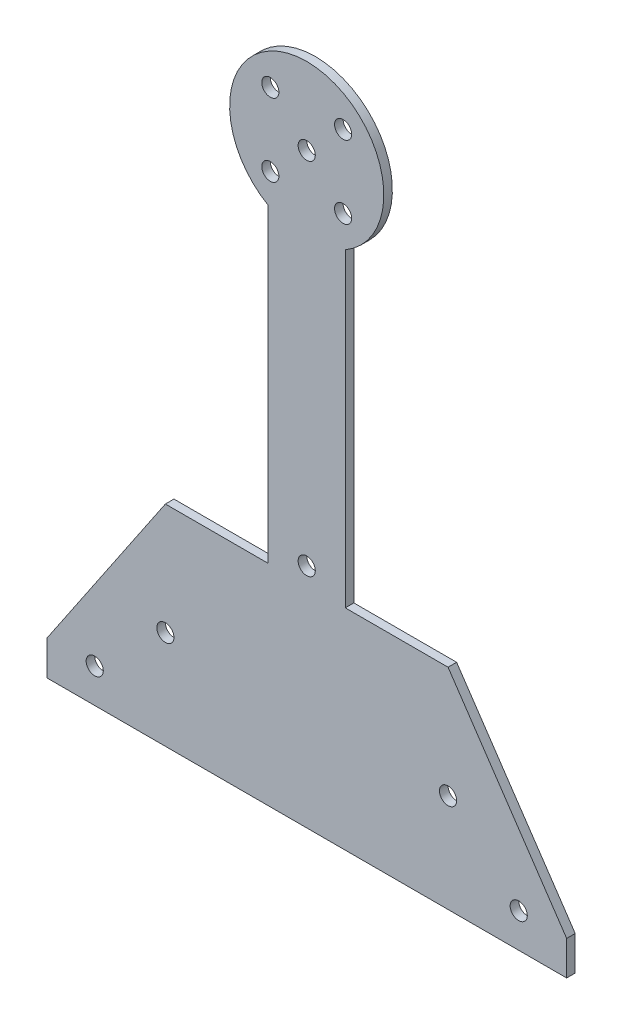
ISO-10303-21;
HEADER;
FILE_DESCRIPTION(('STEP AP214'),'2;1');
FILE_NAME('part.step','',(''),(''),'','','');
FILE_SCHEMA(('AUTOMOTIVE_DESIGN { 1 0 10303 214 1 1 1 1 }'));
ENDSEC;
DATA;
#1=APPLICATION_CONTEXT('core data for automotive mechanical design processes');
#2=APPLICATION_PROTOCOL_DEFINITION('international standard','automotive_design',2000,#1);
#3=PRODUCT_CONTEXT('',#1,'mechanical');
#4=PRODUCT('Part','Part','',(#3));
#5=PRODUCT_RELATED_PRODUCT_CATEGORY('part','',(#4));
#6=PRODUCT_DEFINITION_FORMATION('','',#4);
#7=PRODUCT_DEFINITION_CONTEXT('part definition',#1,'design');
#8=PRODUCT_DEFINITION('design','',#6,#7);
#9=PRODUCT_DEFINITION_SHAPE('','',#8);
#10=(LENGTH_UNIT() NAMED_UNIT(*) SI_UNIT(.MILLI.,.METRE.));
#11=(NAMED_UNIT(*) PLANE_ANGLE_UNIT() SI_UNIT($,.RADIAN.));
#12=(NAMED_UNIT(*) SI_UNIT($,.STERADIAN.) SOLID_ANGLE_UNIT());
#13=UNCERTAINTY_MEASURE_WITH_UNIT(LENGTH_MEASURE(1.E-05),#10,'distance_accuracy_value','');
#14=(GEOMETRIC_REPRESENTATION_CONTEXT(3) GLOBAL_UNCERTAINTY_ASSIGNED_CONTEXT((#13)) GLOBAL_UNIT_ASSIGNED_CONTEXT((#10,
#11,#12)) REPRESENTATION_CONTEXT('',''));
#15=CARTESIAN_POINT('',(0.,0.,0.));
#16=DIRECTION('',(0.,0.,1.));
#17=DIRECTION('',(1.,0.,0.));
#18=AXIS2_PLACEMENT_3D('',#15,#16,#17);
#19=CARTESIAN_POINT('',(-0.291428571428588,121.645714285714,2.));
#20=DIRECTION('',(0.,0.,-1.));
#21=DIRECTION('',(-1.,0.,0.));
#22=AXIS2_PLACEMENT_3D('',#19,#20,#21);
#23=CYLINDRICAL_SURFACE('',#22,18.);
#24=CARTESIAN_POINT('',(-0.291428571428588,121.645714285714,0.));
#25=DIRECTION('',(0.,0.,1.));
#26=DIRECTION('',(1.,0.,0.));
#27=AXIS2_PLACEMENT_3D('',#24,#25,#26);
#28=CIRCLE('',#27,18.);
#29=CARTESIAN_POINT('',(-9.29142857142858,106.057257017594,0.));
#30=VERTEX_POINT('',#29);
#31=CARTESIAN_POINT('',(8.7085714285714,106.057257017594,0.));
#32=VERTEX_POINT('',#31);
#33=EDGE_CURVE('E171',#30,#32,#28,.F.);
#34=ORIENTED_EDGE('',*,*,#33,.F.);
#35=DIRECTION('',(0.,0.,-1.));
#36=VECTOR('',#35,1.);
#37=CARTESIAN_POINT('',(-9.29142857142858,106.057257017594,2.));
#38=LINE('',#37,#36);
#39=CARTESIAN_POINT('',(-9.29142857142858,106.057257017594,2.));
#40=VERTEX_POINT('',#39);
#41=EDGE_CURVE('E11',#40,#30,#38,.T.);
#42=ORIENTED_EDGE('',*,*,#41,.F.);
#43=CARTESIAN_POINT('',(-0.291428571428588,121.645714285714,2.));
#44=DIRECTION('',(0.,0.,1.));
#45=DIRECTION('',(1.,0.,0.));
#46=AXIS2_PLACEMENT_3D('',#43,#44,#45);
#47=CIRCLE('',#46,18.);
#48=CARTESIAN_POINT('',(8.7085714285714,106.057257017594,2.));
#49=VERTEX_POINT('',#48);
#50=EDGE_CURVE('E255',#40,#49,#47,.F.);
#51=ORIENTED_EDGE('',*,*,#50,.T.);
#52=DIRECTION('',(0.,0.,-1.));
#53=VECTOR('',#52,1.);
#54=CARTESIAN_POINT('',(8.7085714285714,106.057257017594,2.));
#55=LINE('',#54,#53);
#56=EDGE_CURVE('E92',#49,#32,#55,.T.);
#57=ORIENTED_EDGE('',*,*,#56,.T.);
#58=EDGE_LOOP('',(#34,#42,#51,#57));
#59=FACE_BOUND('',#58,.T.);
#60=ADVANCED_FACE('F35',(#59),#23,.T.);
#61=CARTESIAN_POINT('',(-9.29142857142858,0.,2.));
#62=DIRECTION('',(-1.,0.,0.));
#63=DIRECTION('',(0.,0.,1.));
#64=AXIS2_PLACEMENT_3D('',#61,#62,#63);
#65=PLANE('',#64);
#66=DIRECTION('',(0.,1.,0.));
#67=VECTOR('',#66,1.);
#68=CARTESIAN_POINT('',(-9.29142857142858,0.,0.));
#69=LINE('',#68,#67);
#70=CARTESIAN_POINT('',(-9.29142857142858,33.6457142857143,0.));
#71=VERTEX_POINT('',#70);
#72=EDGE_CURVE('E174',#71,#30,#69,.T.);
#73=ORIENTED_EDGE('',*,*,#72,.F.);
#74=DIRECTION('',(0.,0.,-1.));
#75=VECTOR('',#74,1.);
#76=CARTESIAN_POINT('',(-9.29142857142858,33.6457142857143,2.));
#77=LINE('',#76,#75);
#78=CARTESIAN_POINT('',(-9.29142857142858,33.6457142857143,2.));
#79=VERTEX_POINT('',#78);
#80=EDGE_CURVE('E44',#79,#71,#77,.T.);
#81=ORIENTED_EDGE('',*,*,#80,.F.);
#82=DIRECTION('',(0.,1.,0.));
#83=VECTOR('',#82,1.);
#84=CARTESIAN_POINT('',(-9.29142857142858,0.,2.));
#85=LINE('',#84,#83);
#86=EDGE_CURVE('E253',#79,#40,#85,.T.);
#87=ORIENTED_EDGE('',*,*,#86,.T.);
#88=ORIENTED_EDGE('',*,*,#41,.T.);
#89=EDGE_LOOP('',(#73,#81,#87,#88));
#90=FACE_BOUND('',#89,.T.);
#91=ADVANCED_FACE('F252',(#90),#65,.T.);
#92=CARTESIAN_POINT('',(0.,33.6457142857143,2.));
#93=DIRECTION('',(0.,-1.,0.));
#94=DIRECTION('',(0.,0.,-1.));
#95=AXIS2_PLACEMENT_3D('',#92,#93,#94);
#96=PLANE('',#95);
#97=DIRECTION('',(-1.,0.,0.));
#98=VECTOR('',#97,1.);
#99=CARTESIAN_POINT('',(0.,33.6457142857143,0.));
#100=LINE('',#99,#98);
#101=CARTESIAN_POINT('',(-33.2914285714285,33.6457142857143,0.));
#102=VERTEX_POINT('',#101);
#103=EDGE_CURVE('E177',#71,#102,#100,.T.);
#104=ORIENTED_EDGE('',*,*,#103,.T.);
#105=DIRECTION('',(0.,0.,-1.));
#106=VECTOR('',#105,1.);
#107=CARTESIAN_POINT('',(-33.2914285714285,33.6457142857143,2.));
#108=LINE('',#107,#106);
#109=CARTESIAN_POINT('',(-33.2914285714285,33.6457142857143,2.));
#110=VERTEX_POINT('',#109);
#111=EDGE_CURVE('E236',#110,#102,#108,.T.);
#112=ORIENTED_EDGE('',*,*,#111,.F.);
#113=DIRECTION('',(-1.,0.,0.));
#114=VECTOR('',#113,1.);
#115=CARTESIAN_POINT('',(0.,33.6457142857143,2.));
#116=LINE('',#115,#114);
#117=EDGE_CURVE('E244',#79,#110,#116,.T.);
#118=ORIENTED_EDGE('',*,*,#117,.F.);
#119=ORIENTED_EDGE('',*,*,#80,.T.);
#120=EDGE_LOOP('',(#104,#112,#118,#119));
#121=FACE_BOUND('',#120,.T.);
#122=ADVANCED_FACE('F241',(#121),#96,.F.);
#123=CARTESIAN_POINT('',(-38.466867215642,25.9839493997509,2.));
#124=DIRECTION('',(0.828660684377225,-0.559751257405884,0.));
#125=DIRECTION('',(0.559751257405884,0.828660684377225,0.));
#126=AXIS2_PLACEMENT_3D('',#123,#124,#125);
#127=PLANE('',#126);
#128=DIRECTION('',(-0.559751257405884,-0.828660684377225,0.));
#129=VECTOR('',#128,1.);
#130=CARTESIAN_POINT('',(-38.466867215642,25.9839493997509,0.));
#131=LINE('',#130,#129);
#132=CARTESIAN_POINT('',(-60.9864815482557,-7.35428571428547,0.));
#133=VERTEX_POINT('',#132);
#134=EDGE_CURVE('E180',#102,#133,#131,.T.);
#135=ORIENTED_EDGE('',*,*,#134,.T.);
#136=DIRECTION('',(0.,0.,-1.));
#137=VECTOR('',#136,1.);
#138=CARTESIAN_POINT('',(-60.9864815482557,-7.35428571428547,2.));
#139=LINE('',#138,#137);
#140=CARTESIAN_POINT('',(-60.9864815482557,-7.35428571428547,2.));
#141=VERTEX_POINT('',#140);
#142=EDGE_CURVE('E233',#141,#133,#139,.T.);
#143=ORIENTED_EDGE('',*,*,#142,.F.);
#144=DIRECTION('',(-0.559751257405884,-0.828660684377225,0.));
#145=VECTOR('',#144,1.);
#146=CARTESIAN_POINT('',(-38.466867215642,25.9839493997509,2.));
#147=LINE('',#146,#145);
#148=EDGE_CURVE('E262',#110,#141,#147,.T.);
#149=ORIENTED_EDGE('',*,*,#148,.F.);
#150=ORIENTED_EDGE('',*,*,#111,.T.);
#151=EDGE_LOOP('',(#135,#143,#149,#150));
#152=FACE_BOUND('',#151,.T.);
#153=ADVANCED_FACE('F280',(#152),#127,.F.);
#154=CARTESIAN_POINT('',(-60.9864815482558,0.,2.));
#155=DIRECTION('',(1.,0.,0.));
#156=DIRECTION('',(0.,0.,-1.));
#157=AXIS2_PLACEMENT_3D('',#154,#155,#156);
#158=PLANE('',#157);
#159=DIRECTION('',(0.,-1.,0.));
#160=VECTOR('',#159,1.);
#161=CARTESIAN_POINT('',(-60.9864815482558,0.,0.));
#162=LINE('',#161,#160);
#163=CARTESIAN_POINT('',(-60.9864815482558,-15.3542857142855,0.));
#164=VERTEX_POINT('',#163);
#165=EDGE_CURVE('E183',#133,#164,#162,.T.);
#166=ORIENTED_EDGE('',*,*,#165,.T.);
#167=DIRECTION('',(0.,0.,-1.));
#168=VECTOR('',#167,1.);
#169=CARTESIAN_POINT('',(-60.9864815482558,-15.3542857142855,2.));
#170=LINE('',#169,#168);
#171=CARTESIAN_POINT('',(-60.9864815482558,-15.3542857142855,2.));
#172=VERTEX_POINT('',#171);
#173=EDGE_CURVE('E230',#172,#164,#170,.T.);
#174=ORIENTED_EDGE('',*,*,#173,.F.);
#175=DIRECTION('',(0.,-1.,0.));
#176=VECTOR('',#175,1.);
#177=CARTESIAN_POINT('',(-60.9864815482558,0.,2.));
#178=LINE('',#177,#176);
#179=EDGE_CURVE('E265',#141,#172,#178,.T.);
#180=ORIENTED_EDGE('',*,*,#179,.F.);
#181=ORIENTED_EDGE('',*,*,#142,.T.);
#182=EDGE_LOOP('',(#166,#174,#180,#181));
#183=FACE_BOUND('',#182,.T.);
#184=ADVANCED_FACE('F277',(#183),#158,.F.);
#185=CARTESIAN_POINT('',(0.,-15.3542857142855,2.));
#186=DIRECTION('',(0.,1.,0.));
#187=DIRECTION('',(0.,0.,1.));
#188=AXIS2_PLACEMENT_3D('',#185,#186,#187);
#189=PLANE('',#188);
#190=DIRECTION('',(1.,0.,0.));
#191=VECTOR('',#190,1.);
#192=CARTESIAN_POINT('',(0.,-15.3542857142855,0.));
#193=LINE('',#192,#191);
#194=CARTESIAN_POINT('',(60.4036244053986,-15.3542857142855,0.));
#195=VERTEX_POINT('',#194);
#196=EDGE_CURVE('E186',#164,#195,#193,.T.);
#197=ORIENTED_EDGE('',*,*,#196,.T.);
#198=DIRECTION('',(0.,0.,-1.));
#199=VECTOR('',#198,1.);
#200=CARTESIAN_POINT('',(60.4036244053986,-15.3542857142855,2.));
#201=LINE('',#200,#199);
#202=CARTESIAN_POINT('',(60.4036244053986,-15.3542857142855,2.));
#203=VERTEX_POINT('',#202);
#204=EDGE_CURVE('E228',#203,#195,#201,.T.);
#205=ORIENTED_EDGE('',*,*,#204,.F.);
#206=DIRECTION('',(1.,0.,0.));
#207=VECTOR('',#206,1.);
#208=CARTESIAN_POINT('',(0.,-15.3542857142855,2.));
#209=LINE('',#208,#207);
#210=EDGE_CURVE('E268',#172,#203,#209,.T.);
#211=ORIENTED_EDGE('',*,*,#210,.F.);
#212=ORIENTED_EDGE('',*,*,#173,.T.);
#213=EDGE_LOOP('',(#197,#205,#211,#212));
#214=FACE_BOUND('',#213,.T.);
#215=ADVANCED_FACE('F275',(#214),#189,.F.);
#216=CARTESIAN_POINT('',(60.4036244053986,0.,2.));
#217=DIRECTION('',(1.,0.,0.));
#218=DIRECTION('',(0.,0.,-1.));
#219=AXIS2_PLACEMENT_3D('',#216,#217,#218);
#220=PLANE('',#219);
#221=DIRECTION('',(0.,-1.,0.));
#222=VECTOR('',#221,1.);
#223=CARTESIAN_POINT('',(60.4036244053986,0.,0.));
#224=LINE('',#223,#222);
#225=CARTESIAN_POINT('',(60.4036244053986,-7.35428571428548,0.));
#226=VERTEX_POINT('',#225);
#227=EDGE_CURVE('E189',#226,#195,#224,.T.);
#228=ORIENTED_EDGE('',*,*,#227,.F.);
#229=DIRECTION('',(0.,0.,-1.));
#230=VECTOR('',#229,1.);
#231=CARTESIAN_POINT('',(60.4036244053986,-7.35428571428548,2.));
#232=LINE('',#231,#230);
#233=CARTESIAN_POINT('',(60.4036244053986,-7.35428571428548,2.));
#234=VERTEX_POINT('',#233);
#235=EDGE_CURVE('E127',#234,#226,#232,.T.);
#236=ORIENTED_EDGE('',*,*,#235,.F.);
#237=DIRECTION('',(0.,-1.,0.));
#238=VECTOR('',#237,1.);
#239=CARTESIAN_POINT('',(60.4036244053986,0.,2.));
#240=LINE('',#239,#238);
#241=EDGE_CURVE('E134',#234,#203,#240,.T.);
#242=ORIENTED_EDGE('',*,*,#241,.T.);
#243=ORIENTED_EDGE('',*,*,#204,.T.);
#244=EDGE_LOOP('',(#228,#236,#242,#243));
#245=FACE_BOUND('',#244,.T.);
#246=ADVANCED_FACE('F271',(#245),#220,.T.);
#247=CARTESIAN_POINT('',(38.0666317296824,25.7135946927544,2.));
#248=DIRECTION('',(0.828660684377225,0.559751257405884,0.));
#249=DIRECTION('',(-0.559751257405884,0.828660684377225,0.));
#250=AXIS2_PLACEMENT_3D('',#247,#248,#249);
#251=PLANE('',#250);
#252=DIRECTION('',(0.559751257405884,-0.828660684377225,0.));
#253=VECTOR('',#252,1.);
#254=CARTESIAN_POINT('',(38.0666317296824,25.7135946927544,0.));
#255=LINE('',#254,#253);
#256=CARTESIAN_POINT('',(32.7085714285713,33.6457142857143,0.));
#257=VERTEX_POINT('',#256);
#258=EDGE_CURVE('E122',#257,#226,#255,.T.);
#259=ORIENTED_EDGE('',*,*,#258,.F.);
#260=DIRECTION('',(0.,0.,-1.));
#261=VECTOR('',#260,1.);
#262=CARTESIAN_POINT('',(32.7085714285713,33.6457142857143,2.));
#263=LINE('',#262,#261);
#264=CARTESIAN_POINT('',(32.7085714285713,33.6457142857143,2.));
#265=VERTEX_POINT('',#264);
#266=EDGE_CURVE('E117',#265,#257,#263,.T.);
#267=ORIENTED_EDGE('',*,*,#266,.F.);
#268=DIRECTION('',(0.559751257405884,-0.828660684377225,0.));
#269=VECTOR('',#268,1.);
#270=CARTESIAN_POINT('',(38.0666317296824,25.7135946927544,2.));
#271=LINE('',#270,#269);
#272=EDGE_CURVE('E120',#265,#234,#271,.T.);
#273=ORIENTED_EDGE('',*,*,#272,.T.);
#274=ORIENTED_EDGE('',*,*,#235,.T.);
#275=EDGE_LOOP('',(#259,#267,#273,#274));
#276=FACE_BOUND('',#275,.T.);
#277=ADVANCED_FACE('F119',(#276),#251,.T.);
#278=CARTESIAN_POINT('',(0.,33.6457142857143,2.));
#279=DIRECTION('',(0.,1.,0.));
#280=DIRECTION('',(0.,0.,1.));
#281=AXIS2_PLACEMENT_3D('',#278,#279,#280);
#282=PLANE('',#281);
#283=DIRECTION('',(1.,0.,0.));
#284=VECTOR('',#283,1.);
#285=CARTESIAN_POINT('',(0.,33.6457142857143,0.));
#286=LINE('',#285,#284);
#287=CARTESIAN_POINT('',(8.7085714285714,33.6457142857143,0.));
#288=VERTEX_POINT('',#287);
#289=EDGE_CURVE('E193',#288,#257,#286,.T.);
#290=ORIENTED_EDGE('',*,*,#289,.F.);
#291=DIRECTION('',(0.,0.,-1.));
#292=VECTOR('',#291,1.);
#293=CARTESIAN_POINT('',(8.7085714285714,33.6457142857143,2.));
#294=LINE('',#293,#292);
#295=CARTESIAN_POINT('',(8.7085714285714,33.6457142857143,2.));
#296=VERTEX_POINT('',#295);
#297=EDGE_CURVE('E85',#296,#288,#294,.T.);
#298=ORIENTED_EDGE('',*,*,#297,.F.);
#299=DIRECTION('',(1.,0.,0.));
#300=VECTOR('',#299,1.);
#301=CARTESIAN_POINT('',(0.,33.6457142857143,2.));
#302=LINE('',#301,#300);
#303=EDGE_CURVE('E132',#296,#265,#302,.T.);
#304=ORIENTED_EDGE('',*,*,#303,.T.);
#305=ORIENTED_EDGE('',*,*,#266,.T.);
#306=EDGE_LOOP('',(#290,#298,#304,#305));
#307=FACE_BOUND('',#306,.T.);
#308=ADVANCED_FACE('F136',(#307),#282,.T.);
#309=CARTESIAN_POINT('',(-33.2914285714285,7.64571428571553,2.));
#310=DIRECTION('',(0.,0.,-1.));
#311=DIRECTION('',(-1.,0.,0.));
#312=AXIS2_PLACEMENT_3D('',#309,#310,#311);
#313=CYLINDRICAL_SURFACE('',#312,2.);
#314=CARTESIAN_POINT('',(-33.2914285714285,7.64571428571553,2.));
#315=DIRECTION('',(0.,0.,1.));
#316=DIRECTION('',(1.,0.,0.));
#317=AXIS2_PLACEMENT_3D('',#314,#315,#316);
#318=CIRCLE('',#317,2.);
#319=CARTESIAN_POINT('',(-31.2914285714285,7.64571428571553,2.));
#320=VERTEX_POINT('',#319);
#321=EDGE_CURVE('E162',#320,#320,#318,.T.);
#322=ORIENTED_EDGE('',*,*,#321,.T.);
#323=EDGE_LOOP('',(#322));
#324=FACE_BOUND('',#323,.T.);
#325=CARTESIAN_POINT('',(-33.2914285714285,7.64571428571553,0.));
#326=DIRECTION('',(0.,0.,1.));
#327=DIRECTION('',(1.,0.,0.));
#328=AXIS2_PLACEMENT_3D('',#325,#326,#327);
#329=CIRCLE('',#328,2.);
#330=CARTESIAN_POINT('',(-31.2914285714285,7.64571428571553,0.));
#331=VERTEX_POINT('',#330);
#332=EDGE_CURVE('E218',#331,#331,#329,.T.);
#333=ORIENTED_EDGE('',*,*,#332,.F.);
#334=EDGE_LOOP('',(#333));
#335=FACE_BOUND('',#334,.T.);
#336=ADVANCED_FACE('F344',(#324,#335),#313,.F.);
#337=CARTESIAN_POINT('',(49.2085714285714,-7.3542857142857,2.));
#338=DIRECTION('',(0.,0.,-1.));
#339=DIRECTION('',(-1.,0.,0.));
#340=AXIS2_PLACEMENT_3D('',#337,#338,#339);
#341=CYLINDRICAL_SURFACE('',#340,2.);
#342=CARTESIAN_POINT('',(49.2085714285714,-7.3542857142857,2.));
#343=DIRECTION('',(0.,0.,1.));
#344=DIRECTION('',(1.,0.,0.));
#345=AXIS2_PLACEMENT_3D('',#342,#343,#344);
#346=CIRCLE('',#345,2.);
#347=CARTESIAN_POINT('',(51.2085714285714,-7.3542857142857,2.));
#348=VERTEX_POINT('',#347);
#349=EDGE_CURVE('E159',#348,#348,#346,.T.);
#350=ORIENTED_EDGE('',*,*,#349,.T.);
#351=EDGE_LOOP('',(#350));
#352=FACE_BOUND('',#351,.T.);
#353=CARTESIAN_POINT('',(49.2085714285714,-7.3542857142857,0.));
#354=DIRECTION('',(0.,0.,1.));
#355=DIRECTION('',(1.,0.,0.));
#356=AXIS2_PLACEMENT_3D('',#353,#354,#355);
#357=CIRCLE('',#356,2.);
#358=CARTESIAN_POINT('',(51.2085714285714,-7.3542857142857,0.));
#359=VERTEX_POINT('',#358);
#360=EDGE_CURVE('E215',#359,#359,#357,.T.);
#361=ORIENTED_EDGE('',*,*,#360,.F.);
#362=EDGE_LOOP('',(#361));
#363=FACE_BOUND('',#362,.T.);
#364=ADVANCED_FACE('F353',(#352,#363),#341,.F.);
#365=CARTESIAN_POINT('',(-49.7914285714285,-7.35428571428548,2.));
#366=DIRECTION('',(0.,0.,-1.));
#367=DIRECTION('',(-1.,0.,0.));
#368=AXIS2_PLACEMENT_3D('',#365,#366,#367);
#369=CYLINDRICAL_SURFACE('',#368,2.);
#370=CARTESIAN_POINT('',(-49.7914285714285,-7.35428571428548,2.));
#371=DIRECTION('',(0.,0.,1.));
#372=DIRECTION('',(1.,0.,0.));
#373=AXIS2_PLACEMENT_3D('',#370,#371,#372);
#374=CIRCLE('',#373,2.);
#375=CARTESIAN_POINT('',(-47.7914285714285,-7.35428571428548,2.));
#376=VERTEX_POINT('',#375);
#377=EDGE_CURVE('E156',#376,#376,#374,.F.);
#378=ORIENTED_EDGE('',*,*,#377,.F.);
#379=EDGE_LOOP('',(#378));
#380=FACE_BOUND('',#379,.T.);
#381=CARTESIAN_POINT('',(-49.7914285714285,-7.35428571428548,0.));
#382=DIRECTION('',(0.,0.,1.));
#383=DIRECTION('',(1.,0.,0.));
#384=AXIS2_PLACEMENT_3D('',#381,#382,#383);
#385=CIRCLE('',#384,2.);
#386=CARTESIAN_POINT('',(-47.7914285714285,-7.35428571428548,0.));
#387=VERTEX_POINT('',#386);
#388=EDGE_CURVE('E212',#387,#387,#385,.F.);
#389=ORIENTED_EDGE('',*,*,#388,.T.);
#390=EDGE_LOOP('',(#389));
#391=FACE_BOUND('',#390,.T.);
#392=ADVANCED_FACE('F363',(#380,#391),#369,.F.);
#393=CARTESIAN_POINT('',(8.20857142857141,130.145714285714,2.));
#394=DIRECTION('',(0.,0.,-1.));
#395=DIRECTION('',(-1.,0.,0.));
#396=AXIS2_PLACEMENT_3D('',#393,#394,#395);
#397=CYLINDRICAL_SURFACE('',#396,2.);
#398=CARTESIAN_POINT('',(8.20857142857141,130.145714285714,2.));
#399=DIRECTION('',(0.,0.,1.));
#400=DIRECTION('',(1.,0.,0.));
#401=AXIS2_PLACEMENT_3D('',#398,#399,#400);
#402=CIRCLE('',#401,2.);
#403=CARTESIAN_POINT('',(10.2085714285714,130.145714285714,2.));
#404=VERTEX_POINT('',#403);
#405=EDGE_CURVE('E153',#404,#404,#402,.T.);
#406=ORIENTED_EDGE('',*,*,#405,.T.);
#407=EDGE_LOOP('',(#406));
#408=FACE_BOUND('',#407,.T.);
#409=CARTESIAN_POINT('',(8.20857142857141,130.145714285714,0.));
#410=DIRECTION('',(0.,0.,1.));
#411=DIRECTION('',(1.,0.,0.));
#412=AXIS2_PLACEMENT_3D('',#409,#410,#411);
#413=CIRCLE('',#412,2.);
#414=CARTESIAN_POINT('',(10.2085714285714,130.145714285714,0.));
#415=VERTEX_POINT('',#414);
#416=EDGE_CURVE('E209',#415,#415,#413,.T.);
#417=ORIENTED_EDGE('',*,*,#416,.F.);
#418=EDGE_LOOP('',(#417));
#419=FACE_BOUND('',#418,.T.);
#420=ADVANCED_FACE('F373',(#408,#419),#397,.F.);
#421=CARTESIAN_POINT('',(-0.291428571428588,37.6457142857143,2.));
#422=DIRECTION('',(0.,0.,-1.));
#423=DIRECTION('',(-1.,0.,0.));
#424=AXIS2_PLACEMENT_3D('',#421,#422,#423);
#425=CYLINDRICAL_SURFACE('',#424,2.);
#426=CARTESIAN_POINT('',(-0.291428571428588,37.6457142857143,2.));
#427=DIRECTION('',(0.,0.,1.));
#428=DIRECTION('',(1.,0.,0.));
#429=AXIS2_PLACEMENT_3D('',#426,#427,#428);
#430=CIRCLE('',#429,2.);
#431=CARTESIAN_POINT('',(1.70857142857141,37.6457142857143,2.));
#432=VERTEX_POINT('',#431);
#433=EDGE_CURVE('E150',#432,#432,#430,.T.);
#434=ORIENTED_EDGE('',*,*,#433,.T.);
#435=EDGE_LOOP('',(#434));
#436=FACE_BOUND('',#435,.T.);
#437=CARTESIAN_POINT('',(-0.291428571428588,37.6457142857143,0.));
#438=DIRECTION('',(0.,0.,1.));
#439=DIRECTION('',(1.,0.,0.));
#440=AXIS2_PLACEMENT_3D('',#437,#438,#439);
#441=CIRCLE('',#440,2.);
#442=CARTESIAN_POINT('',(1.70857142857141,37.6457142857143,0.));
#443=VERTEX_POINT('',#442);
#444=EDGE_CURVE('E206',#443,#443,#441,.T.);
#445=ORIENTED_EDGE('',*,*,#444,.F.);
#446=EDGE_LOOP('',(#445));
#447=FACE_BOUND('',#446,.T.);
#448=ADVANCED_FACE('F383',(#436,#447),#425,.F.);
#449=CARTESIAN_POINT('',(8.20857142857163,113.145714285714,2.));
#450=DIRECTION('',(0.,0.,-1.));
#451=DIRECTION('',(-1.,0.,0.));
#452=AXIS2_PLACEMENT_3D('',#449,#450,#451);
#453=CYLINDRICAL_SURFACE('',#452,2.);
#454=CARTESIAN_POINT('',(8.20857142857163,113.145714285714,2.));
#455=DIRECTION('',(0.,0.,1.));
#456=DIRECTION('',(1.,0.,0.));
#457=AXIS2_PLACEMENT_3D('',#454,#455,#456);
#458=CIRCLE('',#457,2.);
#459=CARTESIAN_POINT('',(10.2085714285716,113.145714285714,2.));
#460=VERTEX_POINT('',#459);
#461=EDGE_CURVE('E147',#460,#460,#458,.T.);
#462=ORIENTED_EDGE('',*,*,#461,.T.);
#463=EDGE_LOOP('',(#462));
#464=FACE_BOUND('',#463,.T.);
#465=CARTESIAN_POINT('',(8.20857142857163,113.145714285714,0.));
#466=DIRECTION('',(0.,0.,1.));
#467=DIRECTION('',(1.,0.,0.));
#468=AXIS2_PLACEMENT_3D('',#465,#466,#467);
#469=CIRCLE('',#468,2.);
#470=CARTESIAN_POINT('',(10.2085714285716,113.145714285714,0.));
#471=VERTEX_POINT('',#470);
#472=EDGE_CURVE('E203',#471,#471,#469,.T.);
#473=ORIENTED_EDGE('',*,*,#472,.F.);
#474=EDGE_LOOP('',(#473));
#475=FACE_BOUND('',#474,.T.);
#476=ADVANCED_FACE('F393',(#464,#475),#453,.F.);
#477=CARTESIAN_POINT('',(-8.7914285714284,113.145714285714,2.));
#478=DIRECTION('',(0.,0.,-1.));
#479=DIRECTION('',(-1.,0.,0.));
#480=AXIS2_PLACEMENT_3D('',#477,#478,#479);
#481=CYLINDRICAL_SURFACE('',#480,2.);
#482=CARTESIAN_POINT('',(-8.7914285714284,113.145714285714,2.));
#483=DIRECTION('',(0.,0.,1.));
#484=DIRECTION('',(1.,0.,0.));
#485=AXIS2_PLACEMENT_3D('',#482,#483,#484);
#486=CIRCLE('',#485,2.);
#487=CARTESIAN_POINT('',(-6.79142857142841,113.145714285714,2.));
#488=VERTEX_POINT('',#487);
#489=EDGE_CURVE('E144',#488,#488,#486,.T.);
#490=ORIENTED_EDGE('',*,*,#489,.T.);
#491=EDGE_LOOP('',(#490));
#492=FACE_BOUND('',#491,.T.);
#493=CARTESIAN_POINT('',(-8.7914285714284,113.145714285714,0.));
#494=DIRECTION('',(0.,0.,1.));
#495=DIRECTION('',(1.,0.,0.));
#496=AXIS2_PLACEMENT_3D('',#493,#494,#495);
#497=CIRCLE('',#496,2.);
#498=CARTESIAN_POINT('',(-6.79142857142841,113.145714285714,0.));
#499=VERTEX_POINT('',#498);
#500=EDGE_CURVE('E200',#499,#499,#497,.T.);
#501=ORIENTED_EDGE('',*,*,#500,.F.);
#502=EDGE_LOOP('',(#501));
#503=FACE_BOUND('',#502,.T.);
#504=ADVANCED_FACE('F403',(#492,#503),#481,.F.);
#505=CARTESIAN_POINT('',(-8.79142857142853,130.145714285714,2.));
#506=DIRECTION('',(0.,0.,-1.));
#507=DIRECTION('',(-1.,0.,0.));
#508=AXIS2_PLACEMENT_3D('',#505,#506,#507);
#509=CYLINDRICAL_SURFACE('',#508,1.99999999999999);
#510=CARTESIAN_POINT('',(-8.79142857142853,130.145714285714,2.));
#511=DIRECTION('',(0.,0.,1.));
#512=DIRECTION('',(1.,0.,0.));
#513=AXIS2_PLACEMENT_3D('',#510,#511,#512);
#514=CIRCLE('',#513,1.99999999999999);
#515=CARTESIAN_POINT('',(-6.79142857142855,130.145714285714,2.));
#516=VERTEX_POINT('',#515);
#517=EDGE_CURVE('E138',#516,#516,#514,.T.);
#518=ORIENTED_EDGE('',*,*,#517,.T.);
#519=EDGE_LOOP('',(#518));
#520=FACE_BOUND('',#519,.T.);
#521=CARTESIAN_POINT('',(-8.79142857142853,130.145714285714,0.));
#522=DIRECTION('',(0.,0.,1.));
#523=DIRECTION('',(1.,0.,0.));
#524=AXIS2_PLACEMENT_3D('',#521,#522,#523);
#525=CIRCLE('',#524,1.99999999999999);
#526=CARTESIAN_POINT('',(-6.79142857142855,130.145714285714,0.));
#527=VERTEX_POINT('',#526);
#528=EDGE_CURVE('E197',#527,#527,#525,.T.);
#529=ORIENTED_EDGE('',*,*,#528,.F.);
#530=EDGE_LOOP('',(#529));
#531=FACE_BOUND('',#530,.T.);
#532=ADVANCED_FACE('F413',(#520,#531),#509,.F.);
#533=CARTESIAN_POINT('',(8.7085714285714,0.,2.));
#534=DIRECTION('',(-1.,0.,0.));
#535=DIRECTION('',(0.,0.,1.));
#536=AXIS2_PLACEMENT_3D('',#533,#534,#535);
#537=PLANE('',#536);
#538=DIRECTION('',(0.,1.,0.));
#539=VECTOR('',#538,1.);
#540=CARTESIAN_POINT('',(8.7085714285714,0.,0.));
#541=LINE('',#540,#539);
#542=EDGE_CURVE('E195',#288,#32,#541,.T.);
#543=ORIENTED_EDGE('',*,*,#542,.T.);
#544=ORIENTED_EDGE('',*,*,#56,.F.);
#545=DIRECTION('',(0.,1.,0.));
#546=VECTOR('',#545,1.);
#547=CARTESIAN_POINT('',(8.7085714285714,0.,2.));
#548=LINE('',#547,#546);
#549=EDGE_CURVE('E52',#296,#49,#548,.T.);
#550=ORIENTED_EDGE('',*,*,#549,.F.);
#551=ORIENTED_EDGE('',*,*,#297,.T.);
#552=EDGE_LOOP('',(#543,#544,#550,#551));
#553=FACE_BOUND('',#552,.T.);
#554=ADVANCED_FACE('F254',(#553),#537,.F.);
#555=CARTESIAN_POINT('',(-0.291428571428588,121.645714285714,2.));
#556=DIRECTION('',(0.,0.,-1.));
#557=DIRECTION('',(-1.,0.,0.));
#558=AXIS2_PLACEMENT_3D('',#555,#556,#557);
#559=CYLINDRICAL_SURFACE('',#558,2.);
#560=CARTESIAN_POINT('',(-0.291428571428588,121.645714285714,2.));
#561=DIRECTION('',(0.,0.,1.));
#562=DIRECTION('',(1.,0.,0.));
#563=AXIS2_PLACEMENT_3D('',#560,#561,#562);
#564=CIRCLE('',#563,2.);
#565=CARTESIAN_POINT('',(1.70857142857141,121.645714285714,2.));
#566=VERTEX_POINT('',#565);
#567=EDGE_CURVE('E224',#566,#566,#564,.T.);
#568=ORIENTED_EDGE('',*,*,#567,.T.);
#569=EDGE_LOOP('',(#568));
#570=FACE_BOUND('',#569,.T.);
#571=CARTESIAN_POINT('',(-0.291428571428588,121.645714285714,0.));
#572=DIRECTION('',(0.,0.,1.));
#573=DIRECTION('',(1.,0.,0.));
#574=AXIS2_PLACEMENT_3D('',#571,#572,#573);
#575=CIRCLE('',#574,2.);
#576=CARTESIAN_POINT('',(1.70857142857141,121.645714285714,0.));
#577=VERTEX_POINT('',#576);
#578=EDGE_CURVE('E168',#577,#577,#575,.T.);
#579=ORIENTED_EDGE('',*,*,#578,.F.);
#580=EDGE_LOOP('',(#579));
#581=FACE_BOUND('',#580,.T.);
#582=ADVANCED_FACE('F37',(#570,#581),#559,.F.);
#583=CARTESIAN_POINT('',(32.7085714285715,7.64571428571414,2.));
#584=DIRECTION('',(0.,0.,-1.));
#585=DIRECTION('',(-1.,0.,0.));
#586=AXIS2_PLACEMENT_3D('',#583,#584,#585);
#587=CYLINDRICAL_SURFACE('',#586,2.);
#588=CARTESIAN_POINT('',(32.7085714285715,7.64571428571414,2.));
#589=DIRECTION('',(0.,0.,1.));
#590=DIRECTION('',(1.,0.,0.));
#591=AXIS2_PLACEMENT_3D('',#588,#589,#590);
#592=CIRCLE('',#591,2.);
#593=CARTESIAN_POINT('',(34.7085714285715,7.64571428571414,2.));
#594=VERTEX_POINT('',#593);
#595=EDGE_CURVE('E165',#594,#594,#592,.F.);
#596=ORIENTED_EDGE('',*,*,#595,.F.);
#597=EDGE_LOOP('',(#596));
#598=FACE_BOUND('',#597,.T.);
#599=CARTESIAN_POINT('',(32.7085714285715,7.64571428571414,0.));
#600=DIRECTION('',(0.,0.,1.));
#601=DIRECTION('',(1.,0.,0.));
#602=AXIS2_PLACEMENT_3D('',#599,#600,#601);
#603=CIRCLE('',#602,2.);
#604=CARTESIAN_POINT('',(34.7085714285715,7.64571428571414,0.));
#605=VERTEX_POINT('',#604);
#606=EDGE_CURVE('E221',#605,#605,#603,.F.);
#607=ORIENTED_EDGE('',*,*,#606,.T.);
#608=EDGE_LOOP('',(#607));
#609=FACE_BOUND('',#608,.T.);
#610=ADVANCED_FACE('F440',(#598,#609),#587,.F.);
#611=CARTESIAN_POINT('',(0.,0.,2.));
#612=DIRECTION('',(0.,0.,1.));
#613=DIRECTION('',(1.,0.,0.));
#614=AXIS2_PLACEMENT_3D('',#611,#612,#613);
#615=PLANE('',#614);
#616=ORIENTED_EDGE('',*,*,#567,.F.);
#617=EDGE_LOOP('',(#616));
#618=FACE_BOUND('',#617,.T.);
#619=ORIENTED_EDGE('',*,*,#50,.F.);
#620=ORIENTED_EDGE('',*,*,#86,.F.);
#621=ORIENTED_EDGE('',*,*,#117,.T.);
#622=ORIENTED_EDGE('',*,*,#148,.T.);
#623=ORIENTED_EDGE('',*,*,#179,.T.);
#624=ORIENTED_EDGE('',*,*,#210,.T.);
#625=ORIENTED_EDGE('',*,*,#241,.F.);
#626=ORIENTED_EDGE('',*,*,#272,.F.);
#627=ORIENTED_EDGE('',*,*,#303,.F.);
#628=ORIENTED_EDGE('',*,*,#549,.T.);
#629=EDGE_LOOP('',(#619,#620,#621,#622,#623,#624,#625,#626,#627,#628));
#630=FACE_BOUND('',#629,.T.);
#631=ORIENTED_EDGE('',*,*,#517,.F.);
#632=EDGE_LOOP('',(#631));
#633=FACE_BOUND('',#632,.T.);
#634=ORIENTED_EDGE('',*,*,#489,.F.);
#635=EDGE_LOOP('',(#634));
#636=FACE_BOUND('',#635,.T.);
#637=ORIENTED_EDGE('',*,*,#461,.F.);
#638=EDGE_LOOP('',(#637));
#639=FACE_BOUND('',#638,.T.);
#640=ORIENTED_EDGE('',*,*,#433,.F.);
#641=EDGE_LOOP('',(#640));
#642=FACE_BOUND('',#641,.T.);
#643=ORIENTED_EDGE('',*,*,#405,.F.);
#644=EDGE_LOOP('',(#643));
#645=FACE_BOUND('',#644,.T.);
#646=ORIENTED_EDGE('',*,*,#377,.T.);
#647=EDGE_LOOP('',(#646));
#648=FACE_BOUND('',#647,.T.);
#649=ORIENTED_EDGE('',*,*,#349,.F.);
#650=EDGE_LOOP('',(#649));
#651=FACE_BOUND('',#650,.T.);
#652=ORIENTED_EDGE('',*,*,#321,.F.);
#653=EDGE_LOOP('',(#652));
#654=FACE_BOUND('',#653,.T.);
#655=ORIENTED_EDGE('',*,*,#595,.T.);
#656=EDGE_LOOP('',(#655));
#657=FACE_BOUND('',#656,.T.);
#658=ADVANCED_FACE('F130',(#618,#630,#633,#636,#639,#642,#645,#648,#651,#654,#657),#615,.T.);
#659=CARTESIAN_POINT('',(0.,0.,0.));
#660=DIRECTION('',(0.,0.,1.));
#661=DIRECTION('',(1.,0.,0.));
#662=AXIS2_PLACEMENT_3D('',#659,#660,#661);
#663=PLANE('',#662);
#664=ORIENTED_EDGE('',*,*,#578,.T.);
#665=EDGE_LOOP('',(#664));
#666=FACE_BOUND('',#665,.T.);
#667=ORIENTED_EDGE('',*,*,#33,.T.);
#668=ORIENTED_EDGE('',*,*,#542,.F.);
#669=ORIENTED_EDGE('',*,*,#289,.T.);
#670=ORIENTED_EDGE('',*,*,#258,.T.);
#671=ORIENTED_EDGE('',*,*,#227,.T.);
#672=ORIENTED_EDGE('',*,*,#196,.F.);
#673=ORIENTED_EDGE('',*,*,#165,.F.);
#674=ORIENTED_EDGE('',*,*,#134,.F.);
#675=ORIENTED_EDGE('',*,*,#103,.F.);
#676=ORIENTED_EDGE('',*,*,#72,.T.);
#677=EDGE_LOOP('',(#667,#668,#669,#670,#671,#672,#673,#674,#675,#676));
#678=FACE_BOUND('',#677,.T.);
#679=ORIENTED_EDGE('',*,*,#528,.T.);
#680=EDGE_LOOP('',(#679));
#681=FACE_BOUND('',#680,.T.);
#682=ORIENTED_EDGE('',*,*,#500,.T.);
#683=EDGE_LOOP('',(#682));
#684=FACE_BOUND('',#683,.T.);
#685=ORIENTED_EDGE('',*,*,#472,.T.);
#686=EDGE_LOOP('',(#685));
#687=FACE_BOUND('',#686,.T.);
#688=ORIENTED_EDGE('',*,*,#444,.T.);
#689=EDGE_LOOP('',(#688));
#690=FACE_BOUND('',#689,.T.);
#691=ORIENTED_EDGE('',*,*,#416,.T.);
#692=EDGE_LOOP('',(#691));
#693=FACE_BOUND('',#692,.T.);
#694=ORIENTED_EDGE('',*,*,#388,.F.);
#695=EDGE_LOOP('',(#694));
#696=FACE_BOUND('',#695,.T.);
#697=ORIENTED_EDGE('',*,*,#360,.T.);
#698=EDGE_LOOP('',(#697));
#699=FACE_BOUND('',#698,.T.);
#700=ORIENTED_EDGE('',*,*,#332,.T.);
#701=EDGE_LOOP('',(#700));
#702=FACE_BOUND('',#701,.T.);
#703=ORIENTED_EDGE('',*,*,#606,.F.);
#704=EDGE_LOOP('',(#703));
#705=FACE_BOUND('',#704,.T.);
#706=ADVANCED_FACE('F250',(#666,#678,#681,#684,#687,#690,#693,#696,#699,#702,#705),#663,.F.);
#707=CLOSED_SHELL('',(#60,#91,#122,#153,#184,#215,#246,#277,#308,#336,#364,#392,#420,#448,#476,
#504,#532,#554,#582,#610,#658,#706));
#708=MANIFOLD_SOLID_BREP('B2',#707);
#709=ADVANCED_BREP_SHAPE_REPRESENTATION('',(#18,#708),#14);
#710=SHAPE_DEFINITION_REPRESENTATION(#9,#709);
ENDSEC;
END-ISO-10303-21;
